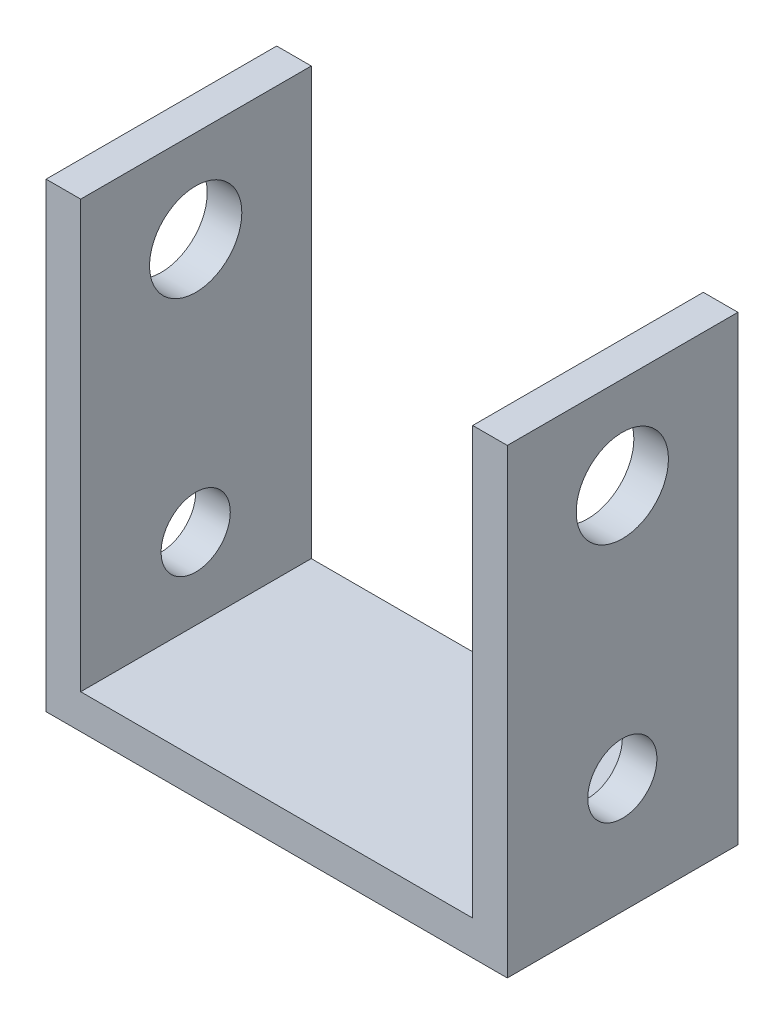
ISO-10303-21;
HEADER;
FILE_DESCRIPTION(('STEP AP214'),'2;1');
FILE_NAME('part.step','',(''),(''),'','','');
FILE_SCHEMA(('AUTOMOTIVE_DESIGN { 1 0 10303 214 1 1 1 1 }'));
ENDSEC;
DATA;
#1=APPLICATION_CONTEXT('core data for automotive mechanical design processes');
#2=APPLICATION_PROTOCOL_DEFINITION('international standard','automotive_design',2000,#1);
#3=PRODUCT_CONTEXT('',#1,'mechanical');
#4=PRODUCT('Part','Part','',(#3));
#5=PRODUCT_RELATED_PRODUCT_CATEGORY('part','',(#4));
#6=PRODUCT_DEFINITION_FORMATION('','',#4);
#7=PRODUCT_DEFINITION_CONTEXT('part definition',#1,'design');
#8=PRODUCT_DEFINITION('design','',#6,#7);
#9=PRODUCT_DEFINITION_SHAPE('','',#8);
#10=(LENGTH_UNIT() NAMED_UNIT(*) SI_UNIT(.MILLI.,.METRE.));
#11=(NAMED_UNIT(*) PLANE_ANGLE_UNIT() SI_UNIT($,.RADIAN.));
#12=(NAMED_UNIT(*) SI_UNIT($,.STERADIAN.) SOLID_ANGLE_UNIT());
#13=UNCERTAINTY_MEASURE_WITH_UNIT(LENGTH_MEASURE(1.E-05),#10,'distance_accuracy_value','');
#14=(GEOMETRIC_REPRESENTATION_CONTEXT(3) GLOBAL_UNCERTAINTY_ASSIGNED_CONTEXT((#13)) GLOBAL_UNIT_ASSIGNED_CONTEXT((#10,
#11,#12)) REPRESENTATION_CONTEXT('',''));
#15=CARTESIAN_POINT('',(0.,0.,0.));
#16=DIRECTION('',(0.,0.,1.));
#17=DIRECTION('',(1.,0.,0.));
#18=AXIS2_PLACEMENT_3D('',#15,#16,#17);
#19=CARTESIAN_POINT('',(-25.3631074324673,18.8628421052632,10.));
#20=DIRECTION('',(0.,-1.,0.));
#21=DIRECTION('',(0.,0.,-1.));
#22=AXIS2_PLACEMENT_3D('',#19,#20,#21);
#23=PLANE('',#22);
#24=DIRECTION('',(-1.,0.,0.));
#25=VECTOR('',#24,1.);
#26=CARTESIAN_POINT('',(-25.3631074324673,18.8628421052632,0.));
#27=LINE('',#26,#25);
#28=CARTESIAN_POINT('',(-25.3631074324673,18.8628421052632,0.));
#29=VERTEX_POINT('',#28);
#30=CARTESIAN_POINT('',(-26.8631074324673,18.8628421052632,0.));
#31=VERTEX_POINT('',#30);
#32=EDGE_CURVE('E129',#29,#31,#27,.T.);
#33=ORIENTED_EDGE('',*,*,#32,.T.);
#34=DIRECTION('',(0.,0.,-1.));
#35=VECTOR('',#34,1.);
#36=CARTESIAN_POINT('',(-26.8631074324673,18.8628421052632,10.));
#37=LINE('',#36,#35);
#38=CARTESIAN_POINT('',(-26.8631074324673,18.8628421052632,10.));
#39=VERTEX_POINT('',#38);
#40=EDGE_CURVE('E11',#39,#31,#37,.T.);
#41=ORIENTED_EDGE('',*,*,#40,.F.);
#42=DIRECTION('',(-1.,0.,0.));
#43=VECTOR('',#42,1.);
#44=CARTESIAN_POINT('',(-25.3631074324673,18.8628421052632,10.));
#45=LINE('',#44,#43);
#46=CARTESIAN_POINT('',(-25.3631074324673,18.8628421052632,10.));
#47=VERTEX_POINT('',#46);
#48=EDGE_CURVE('E144',#47,#39,#45,.T.);
#49=ORIENTED_EDGE('',*,*,#48,.F.);
#50=DIRECTION('',(0.,0.,-1.));
#51=VECTOR('',#50,1.);
#52=CARTESIAN_POINT('',(-25.3631074324673,18.8628421052632,10.));
#53=LINE('',#52,#51);
#54=EDGE_CURVE('E125',#47,#29,#53,.T.);
#55=ORIENTED_EDGE('',*,*,#54,.T.);
#56=EDGE_LOOP('',(#33,#41,#49,#55));
#57=FACE_BOUND('',#56,.T.);
#58=ADVANCED_FACE('F31',(#57),#23,.F.);
#59=CARTESIAN_POINT('',(-26.8631074324673,18.8628421052632,10.));
#60=DIRECTION('',(1.,0.,0.));
#61=DIRECTION('',(0.,1.,0.));
#62=AXIS2_PLACEMENT_3D('',#59,#60,#61);
#63=PLANE('',#62);
#64=CARTESIAN_POINT('',(-26.8631074324673,3.86284210526316,5.01241151123422));
#65=DIRECTION('',(1.,0.,0.));
#66=DIRECTION('',(0.,0.,-1.));
#67=AXIS2_PLACEMENT_3D('',#64,#65,#66);
#68=CIRCLE('',#67,1.5);
#69=CARTESIAN_POINT('',(-26.8631074324673,3.86284210526316,3.51241151123422));
#70=VERTEX_POINT('',#69);
#71=EDGE_CURVE('E286',#70,#70,#68,.T.);
#72=ORIENTED_EDGE('',*,*,#71,.T.);
#73=EDGE_LOOP('',(#72));
#74=FACE_BOUND('',#73,.T.);
#75=CARTESIAN_POINT('',(-26.8631074324673,14.8628421052632,5.01241151123423));
#76=DIRECTION('',(1.,0.,0.));
#77=DIRECTION('',(0.,0.,-1.));
#78=AXIS2_PLACEMENT_3D('',#75,#76,#77);
#79=CIRCLE('',#78,2.);
#80=CARTESIAN_POINT('',(-26.8631074324673,14.8628421052632,3.01241151123422));
#81=VERTEX_POINT('',#80);
#82=EDGE_CURVE('E157',#81,#81,#79,.T.);
#83=ORIENTED_EDGE('',*,*,#82,.T.);
#84=EDGE_LOOP('',(#83));
#85=FACE_BOUND('',#84,.T.);
#86=DIRECTION('',(0.,-1.,0.));
#87=VECTOR('',#86,1.);
#88=CARTESIAN_POINT('',(-26.8631074324673,18.8628421052632,0.));
#89=LINE('',#88,#87);
#90=CARTESIAN_POINT('',(-26.8631074324673,-1.13715789473684,0.));
#91=VERTEX_POINT('',#90);
#92=EDGE_CURVE('E132',#31,#91,#89,.T.);
#93=ORIENTED_EDGE('',*,*,#92,.T.);
#94=DIRECTION('',(0.,0.,-1.));
#95=VECTOR('',#94,1.);
#96=CARTESIAN_POINT('',(-26.8631074324673,-1.13715789473684,10.));
#97=LINE('',#96,#95);
#98=CARTESIAN_POINT('',(-26.8631074324673,-1.13715789473684,10.));
#99=VERTEX_POINT('',#98);
#100=EDGE_CURVE('E40',#99,#91,#97,.T.);
#101=ORIENTED_EDGE('',*,*,#100,.F.);
#102=DIRECTION('',(0.,-1.,0.));
#103=VECTOR('',#102,1.);
#104=CARTESIAN_POINT('',(-26.8631074324673,18.8628421052632,10.));
#105=LINE('',#104,#103);
#106=EDGE_CURVE('E92',#39,#99,#105,.T.);
#107=ORIENTED_EDGE('',*,*,#106,.F.);
#108=ORIENTED_EDGE('',*,*,#40,.T.);
#109=EDGE_LOOP('',(#93,#101,#107,#108));
#110=FACE_BOUND('',#109,.T.);
#111=ADVANCED_FACE('F208',(#74,#85,#110),#63,.F.);
#112=CARTESIAN_POINT('',(-26.8631074324673,-1.13715789473684,10.));
#113=DIRECTION('',(0.,1.,0.));
#114=DIRECTION('',(0.,0.,1.));
#115=AXIS2_PLACEMENT_3D('',#112,#113,#114);
#116=PLANE('',#115);
#117=DIRECTION('',(1.,0.,0.));
#118=VECTOR('',#117,1.);
#119=CARTESIAN_POINT('',(-26.8631074324673,-1.13715789473684,0.));
#120=LINE('',#119,#118);
#121=CARTESIAN_POINT('',(-6.86310743246733,-1.13715789473684,0.));
#122=VERTEX_POINT('',#121);
#123=EDGE_CURVE('E135',#91,#122,#120,.T.);
#124=ORIENTED_EDGE('',*,*,#123,.T.);
#125=DIRECTION('',(0.,0.,-1.));
#126=VECTOR('',#125,1.);
#127=CARTESIAN_POINT('',(-6.86310743246733,-1.13715789473684,10.));
#128=LINE('',#127,#126);
#129=CARTESIAN_POINT('',(-6.86310743246733,-1.13715789473684,10.));
#130=VERTEX_POINT('',#129);
#131=EDGE_CURVE('E151',#130,#122,#128,.T.);
#132=ORIENTED_EDGE('',*,*,#131,.F.);
#133=DIRECTION('',(1.,0.,0.));
#134=VECTOR('',#133,1.);
#135=CARTESIAN_POINT('',(-26.8631074324673,-1.13715789473684,10.));
#136=LINE('',#135,#134);
#137=EDGE_CURVE('E175',#99,#130,#136,.T.);
#138=ORIENTED_EDGE('',*,*,#137,.F.);
#139=ORIENTED_EDGE('',*,*,#100,.T.);
#140=EDGE_LOOP('',(#124,#132,#138,#139));
#141=FACE_BOUND('',#140,.T.);
#142=ADVANCED_FACE('F212',(#141),#116,.F.);
#143=CARTESIAN_POINT('',(-6.86310743246733,-1.13715789473684,10.));
#144=DIRECTION('',(-1.,0.,0.));
#145=DIRECTION('',(0.,0.,1.));
#146=AXIS2_PLACEMENT_3D('',#143,#144,#145);
#147=PLANE('',#146);
#148=CARTESIAN_POINT('',(-6.86310743246733,3.86284210526316,5.01241151123422));
#149=DIRECTION('',(1.,0.,0.));
#150=DIRECTION('',(0.,0.,-1.));
#151=AXIS2_PLACEMENT_3D('',#148,#149,#150);
#152=CIRCLE('',#151,1.5);
#153=CARTESIAN_POINT('',(-6.86310743246733,3.86284210526316,3.51241151123422));
#154=VERTEX_POINT('',#153);
#155=EDGE_CURVE('E285',#154,#154,#152,.T.);
#156=ORIENTED_EDGE('',*,*,#155,.F.);
#157=EDGE_LOOP('',(#156));
#158=FACE_BOUND('',#157,.T.);
#159=CARTESIAN_POINT('',(-6.86310743246733,14.8628421052632,5.01241151123423));
#160=DIRECTION('',(1.,0.,0.));
#161=DIRECTION('',(0.,0.,-1.));
#162=AXIS2_PLACEMENT_3D('',#159,#160,#161);
#163=CIRCLE('',#162,2.);
#164=CARTESIAN_POINT('',(-6.86310743246733,14.8628421052632,3.01241151123422));
#165=VERTEX_POINT('',#164);
#166=EDGE_CURVE('E163',#165,#165,#163,.T.);
#167=ORIENTED_EDGE('',*,*,#166,.F.);
#168=EDGE_LOOP('',(#167));
#169=FACE_BOUND('',#168,.T.);
#170=DIRECTION('',(0.,1.,0.));
#171=VECTOR('',#170,1.);
#172=CARTESIAN_POINT('',(-6.86310743246733,-1.13715789473684,0.));
#173=LINE('',#172,#171);
#174=CARTESIAN_POINT('',(-6.86310743246733,18.8628421052632,0.));
#175=VERTEX_POINT('',#174);
#176=EDGE_CURVE('E137',#122,#175,#173,.T.);
#177=ORIENTED_EDGE('',*,*,#176,.T.);
#178=DIRECTION('',(0.,0.,-1.));
#179=VECTOR('',#178,1.);
#180=CARTESIAN_POINT('',(-6.86310743246733,18.8628421052632,10.));
#181=LINE('',#180,#179);
#182=CARTESIAN_POINT('',(-6.86310743246733,18.8628421052632,10.));
#183=VERTEX_POINT('',#182);
#184=EDGE_CURVE('E148',#183,#175,#181,.T.);
#185=ORIENTED_EDGE('',*,*,#184,.F.);
#186=DIRECTION('',(0.,1.,0.));
#187=VECTOR('',#186,1.);
#188=CARTESIAN_POINT('',(-6.86310743246733,-1.13715789473684,10.));
#189=LINE('',#188,#187);
#190=EDGE_CURVE('E177',#130,#183,#189,.T.);
#191=ORIENTED_EDGE('',*,*,#190,.F.);
#192=ORIENTED_EDGE('',*,*,#131,.T.);
#193=EDGE_LOOP('',(#177,#185,#191,#192));
#194=FACE_BOUND('',#193,.T.);
#195=ADVANCED_FACE('F183',(#158,#169,#194),#147,.F.);
#196=CARTESIAN_POINT('',(-6.86310743246733,18.8628421052632,10.));
#197=DIRECTION('',(0.,-1.,0.));
#198=DIRECTION('',(1.,0.,0.));
#199=AXIS2_PLACEMENT_3D('',#196,#197,#198);
#200=PLANE('',#199);
#201=DIRECTION('',(-1.,0.,0.));
#202=VECTOR('',#201,1.);
#203=CARTESIAN_POINT('',(-6.86310743246733,18.8628421052632,0.));
#204=LINE('',#203,#202);
#205=CARTESIAN_POINT('',(-8.36310743246733,18.8628421052632,0.));
#206=VERTEX_POINT('',#205);
#207=EDGE_CURVE('E139',#175,#206,#204,.T.);
#208=ORIENTED_EDGE('',*,*,#207,.T.);
#209=DIRECTION('',(0.,0.,-1.));
#210=VECTOR('',#209,1.);
#211=CARTESIAN_POINT('',(-8.36310743246733,18.8628421052632,10.));
#212=LINE('',#211,#210);
#213=CARTESIAN_POINT('',(-8.36310743246733,18.8628421052632,10.));
#214=VERTEX_POINT('',#213);
#215=EDGE_CURVE('E120',#214,#206,#212,.T.);
#216=ORIENTED_EDGE('',*,*,#215,.F.);
#217=DIRECTION('',(-1.,0.,0.));
#218=VECTOR('',#217,1.);
#219=CARTESIAN_POINT('',(-6.86310743246733,18.8628421052632,10.));
#220=LINE('',#219,#218);
#221=EDGE_CURVE('E111',#183,#214,#220,.T.);
#222=ORIENTED_EDGE('',*,*,#221,.F.);
#223=ORIENTED_EDGE('',*,*,#184,.T.);
#224=EDGE_LOOP('',(#208,#216,#222,#223));
#225=FACE_BOUND('',#224,.T.);
#226=ADVANCED_FACE('F187',(#225),#200,.F.);
#227=CARTESIAN_POINT('',(-8.36310743246733,18.8628421052632,10.));
#228=DIRECTION('',(1.,0.,0.));
#229=DIRECTION('',(0.,1.,0.));
#230=AXIS2_PLACEMENT_3D('',#227,#228,#229);
#231=PLANE('',#230);
#232=CARTESIAN_POINT('',(-8.36310743246733,3.86284210526316,5.01241151123422));
#233=DIRECTION('',(1.,0.,0.));
#234=DIRECTION('',(0.,1.,0.));
#235=AXIS2_PLACEMENT_3D('',#232,#233,#234);
#236=CIRCLE('',#235,1.5);
#237=CARTESIAN_POINT('',(-8.36310743246733,3.86284210526316,3.51241151123422));
#238=VERTEX_POINT('',#237);
#239=EDGE_CURVE('E168',#238,#238,#236,.T.);
#240=ORIENTED_EDGE('',*,*,#239,.T.);
#241=EDGE_LOOP('',(#240));
#242=FACE_BOUND('',#241,.T.);
#243=CARTESIAN_POINT('',(-8.36310743246733,14.8628421052632,5.01241151123423));
#244=DIRECTION('',(1.,0.,0.));
#245=DIRECTION('',(0.,1.,0.));
#246=AXIS2_PLACEMENT_3D('',#243,#244,#245);
#247=CIRCLE('',#246,2.);
#248=CARTESIAN_POINT('',(-8.36310743246733,14.8628421052632,3.01241151123422));
#249=VERTEX_POINT('',#248);
#250=EDGE_CURVE('E133',#249,#249,#247,.T.);
#251=ORIENTED_EDGE('',*,*,#250,.T.);
#252=EDGE_LOOP('',(#251));
#253=FACE_BOUND('',#252,.T.);
#254=DIRECTION('',(0.,-1.,0.));
#255=VECTOR('',#254,1.);
#256=CARTESIAN_POINT('',(-8.36310743246733,18.8628421052632,0.));
#257=LINE('',#256,#255);
#258=CARTESIAN_POINT('',(-8.36310743246733,0.362842105263161,0.));
#259=VERTEX_POINT('',#258);
#260=EDGE_CURVE('E119',#206,#259,#257,.T.);
#261=ORIENTED_EDGE('',*,*,#260,.T.);
#262=DIRECTION('',(0.,0.,-1.));
#263=VECTOR('',#262,1.);
#264=CARTESIAN_POINT('',(-8.36310743246733,0.362842105263161,10.));
#265=LINE('',#264,#263);
#266=CARTESIAN_POINT('',(-8.36310743246733,0.362842105263161,10.));
#267=VERTEX_POINT('',#266);
#268=EDGE_CURVE('E116',#267,#259,#265,.T.);
#269=ORIENTED_EDGE('',*,*,#268,.F.);
#270=DIRECTION('',(0.,-1.,0.));
#271=VECTOR('',#270,1.);
#272=CARTESIAN_POINT('',(-8.36310743246733,18.8628421052632,10.));
#273=LINE('',#272,#271);
#274=EDGE_CURVE('E105',#214,#267,#273,.T.);
#275=ORIENTED_EDGE('',*,*,#274,.F.);
#276=ORIENTED_EDGE('',*,*,#215,.T.);
#277=EDGE_LOOP('',(#261,#269,#275,#276));
#278=FACE_BOUND('',#277,.T.);
#279=ADVANCED_FACE('F117',(#242,#253,#278),#231,.F.);
#280=CARTESIAN_POINT('',(-8.36310743246733,0.362842105263161,10.));
#281=DIRECTION('',(0.,-1.,0.));
#282=DIRECTION('',(1.,0.,0.));
#283=AXIS2_PLACEMENT_3D('',#280,#281,#282);
#284=PLANE('',#283);
#285=DIRECTION('',(-1.,0.,0.));
#286=VECTOR('',#285,1.);
#287=CARTESIAN_POINT('',(-8.36310743246733,0.362842105263161,0.));
#288=LINE('',#287,#286);
#289=CARTESIAN_POINT('',(-25.3631074324673,0.362842105263158,0.));
#290=VERTEX_POINT('',#289);
#291=EDGE_CURVE('E78',#259,#290,#288,.T.);
#292=ORIENTED_EDGE('',*,*,#291,.T.);
#293=DIRECTION('',(0.,0.,-1.));
#294=VECTOR('',#293,1.);
#295=CARTESIAN_POINT('',(-25.3631074324673,0.362842105263158,10.));
#296=LINE('',#295,#294);
#297=CARTESIAN_POINT('',(-25.3631074324673,0.362842105263158,10.));
#298=VERTEX_POINT('',#297);
#299=EDGE_CURVE('E121',#298,#290,#296,.T.);
#300=ORIENTED_EDGE('',*,*,#299,.F.);
#301=DIRECTION('',(-1.,0.,0.));
#302=VECTOR('',#301,1.);
#303=CARTESIAN_POINT('',(-8.36310743246733,0.362842105263161,10.));
#304=LINE('',#303,#302);
#305=EDGE_CURVE('E109',#267,#298,#304,.T.);
#306=ORIENTED_EDGE('',*,*,#305,.F.);
#307=ORIENTED_EDGE('',*,*,#268,.T.);
#308=EDGE_LOOP('',(#292,#300,#306,#307));
#309=FACE_BOUND('',#308,.T.);
#310=ADVANCED_FACE('F123',(#309),#284,.F.);
#311=CARTESIAN_POINT('',(-25.3631074324673,0.362842105263158,10.));
#312=DIRECTION('',(-1.,0.,0.));
#313=DIRECTION('',(0.,-1.,0.));
#314=AXIS2_PLACEMENT_3D('',#311,#312,#313);
#315=PLANE('',#314);
#316=CARTESIAN_POINT('',(-25.3631074324673,3.86284210526316,5.01241151123422));
#317=DIRECTION('',(-1.,0.,0.));
#318=DIRECTION('',(0.,-1.,0.));
#319=AXIS2_PLACEMENT_3D('',#316,#317,#318);
#320=CIRCLE('',#319,1.5);
#321=CARTESIAN_POINT('',(-25.3631074324673,3.86284210526316,3.51241151123422));
#322=VERTEX_POINT('',#321);
#323=EDGE_CURVE('E34',#322,#322,#320,.T.);
#324=ORIENTED_EDGE('',*,*,#323,.T.);
#325=EDGE_LOOP('',(#324));
#326=FACE_BOUND('',#325,.T.);
#327=CARTESIAN_POINT('',(-25.3631074324673,14.8628421052632,5.01241151123423));
#328=DIRECTION('',(-1.,0.,0.));
#329=DIRECTION('',(0.,-1.,0.));
#330=AXIS2_PLACEMENT_3D('',#327,#328,#329);
#331=CIRCLE('',#330,2.);
#332=CARTESIAN_POINT('',(-25.3631074324673,14.8628421052632,3.01241151123422));
#333=VERTEX_POINT('',#332);
#334=EDGE_CURVE('E155',#333,#333,#331,.T.);
#335=ORIENTED_EDGE('',*,*,#334,.T.);
#336=EDGE_LOOP('',(#335));
#337=FACE_BOUND('',#336,.T.);
#338=DIRECTION('',(0.,1.,0.));
#339=VECTOR('',#338,1.);
#340=CARTESIAN_POINT('',(-25.3631074324673,0.362842105263158,0.));
#341=LINE('',#340,#339);
#342=EDGE_CURVE('E84',#290,#29,#341,.T.);
#343=ORIENTED_EDGE('',*,*,#342,.T.);
#344=ORIENTED_EDGE('',*,*,#54,.F.);
#345=DIRECTION('',(0.,1.,0.));
#346=VECTOR('',#345,1.);
#347=CARTESIAN_POINT('',(-25.3631074324673,0.362842105263158,10.));
#348=LINE('',#347,#346);
#349=EDGE_CURVE('E49',#298,#47,#348,.T.);
#350=ORIENTED_EDGE('',*,*,#349,.F.);
#351=ORIENTED_EDGE('',*,*,#299,.T.);
#352=EDGE_LOOP('',(#343,#344,#350,#351));
#353=FACE_BOUND('',#352,.T.);
#354=ADVANCED_FACE('F195',(#326,#337,#353),#315,.F.);
#355=CARTESIAN_POINT('',(-26.8631074324673,18.8628421052632,10.));
#356=DIRECTION('',(0.,0.,1.));
#357=DIRECTION('',(1.,0.,0.));
#358=AXIS2_PLACEMENT_3D('',#355,#356,#357);
#359=PLANE('',#358);
#360=ORIENTED_EDGE('',*,*,#48,.T.);
#361=ORIENTED_EDGE('',*,*,#106,.T.);
#362=ORIENTED_EDGE('',*,*,#137,.T.);
#363=ORIENTED_EDGE('',*,*,#190,.T.);
#364=ORIENTED_EDGE('',*,*,#221,.T.);
#365=ORIENTED_EDGE('',*,*,#274,.T.);
#366=ORIENTED_EDGE('',*,*,#305,.T.);
#367=ORIENTED_EDGE('',*,*,#349,.T.);
#368=EDGE_LOOP('',(#360,#361,#362,#363,#364,#365,#366,#367));
#369=FACE_BOUND('',#368,.T.);
#370=ADVANCED_FACE('F107',(#369),#359,.T.);
#371=CARTESIAN_POINT('',(-26.8631074324673,18.8628421052632,0.));
#372=DIRECTION('',(0.,0.,1.));
#373=DIRECTION('',(1.,0.,0.));
#374=AXIS2_PLACEMENT_3D('',#371,#372,#373);
#375=PLANE('',#374);
#376=ORIENTED_EDGE('',*,*,#32,.F.);
#377=ORIENTED_EDGE('',*,*,#342,.F.);
#378=ORIENTED_EDGE('',*,*,#291,.F.);
#379=ORIENTED_EDGE('',*,*,#260,.F.);
#380=ORIENTED_EDGE('',*,*,#207,.F.);
#381=ORIENTED_EDGE('',*,*,#176,.F.);
#382=ORIENTED_EDGE('',*,*,#123,.F.);
#383=ORIENTED_EDGE('',*,*,#92,.F.);
#384=EDGE_LOOP('',(#376,#377,#378,#379,#380,#381,#382,#383));
#385=FACE_BOUND('',#384,.T.);
#386=ADVANCED_FACE('F190',(#385),#375,.F.);
#387=CARTESIAN_POINT('',(-26.8631074324673,14.8628421052632,5.01241151123423));
#388=DIRECTION('',(1.,0.,0.));
#389=DIRECTION('',(0.,0.,-1.));
#390=AXIS2_PLACEMENT_3D('',#387,#388,#389);
#391=CYLINDRICAL_SURFACE('',#390,2.);
#392=CARTESIAN_POINT('',(-26.8631074324673,14.8628421052632,3.01241151123422));
#393=CARTESIAN_POINT('',(-26.8474824324673,14.8628421052632,3.01241151123422));
#394=CARTESIAN_POINT('',(-26.8318574324673,14.8628421052632,3.01241151123422));
#395=CARTESIAN_POINT('',(-26.8006074324673,14.8628421052632,3.01241151123422));
#396=CARTESIAN_POINT('',(-26.7849824324673,14.8628421052632,3.01241151123422));
#397=CARTESIAN_POINT('',(-26.7537324324673,14.8628421052632,3.01241151123422));
#398=CARTESIAN_POINT('',(-26.7381074324673,14.8628421052632,3.01241151123422));
#399=CARTESIAN_POINT('',(-26.7068574324673,14.8628421052632,3.01241151123422));
#400=CARTESIAN_POINT('',(-26.6912324324673,14.8628421052632,3.01241151123422));
#401=CARTESIAN_POINT('',(-26.6599824324673,14.8628421052632,3.01241151123422));
#402=CARTESIAN_POINT('',(-26.6443574324673,14.8628421052632,3.01241151123422));
#403=CARTESIAN_POINT('',(-26.6131074324673,14.8628421052632,3.01241151123422));
#404=CARTESIAN_POINT('',(-26.5974824324673,14.8628421052632,3.01241151123422));
#405=CARTESIAN_POINT('',(-26.5662324324673,14.8628421052632,3.01241151123422));
#406=CARTESIAN_POINT('',(-26.5506074324673,14.8628421052632,3.01241151123422));
#407=CARTESIAN_POINT('',(-26.5193574324673,14.8628421052632,3.01241151123422));
#408=CARTESIAN_POINT('',(-26.5037324324673,14.8628421052632,3.01241151123422));
#409=CARTESIAN_POINT('',(-26.4724824324673,14.8628421052632,3.01241151123422));
#410=CARTESIAN_POINT('',(-26.4568574324673,14.8628421052632,3.01241151123422));
#411=CARTESIAN_POINT('',(-26.4256074324673,14.8628421052632,3.01241151123422));
#412=CARTESIAN_POINT('',(-26.4099824324673,14.8628421052632,3.01241151123422));
#413=CARTESIAN_POINT('',(-26.3787324324673,14.8628421052632,3.01241151123422));
#414=CARTESIAN_POINT('',(-26.3631074324673,14.8628421052632,3.01241151123422));
#415=CARTESIAN_POINT('',(-26.3318574324673,14.8628421052632,3.01241151123422));
#416=CARTESIAN_POINT('',(-26.3162324324673,14.8628421052632,3.01241151123422));
#417=CARTESIAN_POINT('',(-26.2849824324673,14.8628421052632,3.01241151123422));
#418=CARTESIAN_POINT('',(-26.2693574324673,14.8628421052632,3.01241151123422));
#419=CARTESIAN_POINT('',(-26.2381074324673,14.8628421052632,3.01241151123422));
#420=CARTESIAN_POINT('',(-26.2224824324673,14.8628421052632,3.01241151123422));
#421=CARTESIAN_POINT('',(-26.1912324324673,14.8628421052632,3.01241151123422));
#422=CARTESIAN_POINT('',(-26.1756074324673,14.8628421052632,3.01241151123422));
#423=CARTESIAN_POINT('',(-26.1443574324673,14.8628421052632,3.01241151123422));
#424=CARTESIAN_POINT('',(-26.1287324324673,14.8628421052632,3.01241151123422));
#425=CARTESIAN_POINT('',(-26.0974824324673,14.8628421052632,3.01241151123422));
#426=CARTESIAN_POINT('',(-26.0818574324673,14.8628421052632,3.01241151123422));
#427=CARTESIAN_POINT('',(-26.0506074324673,14.8628421052632,3.01241151123422));
#428=CARTESIAN_POINT('',(-26.0349824324673,14.8628421052632,3.01241151123422));
#429=CARTESIAN_POINT('',(-26.0037324324673,14.8628421052632,3.01241151123422));
#430=CARTESIAN_POINT('',(-25.9881074324673,14.8628421052632,3.01241151123422));
#431=CARTESIAN_POINT('',(-25.9568574324673,14.8628421052632,3.01241151123422));
#432=CARTESIAN_POINT('',(-25.9412324324673,14.8628421052632,3.01241151123422));
#433=CARTESIAN_POINT('',(-25.9099824324673,14.8628421052632,3.01241151123422));
#434=CARTESIAN_POINT('',(-25.8943574324673,14.8628421052632,3.01241151123422));
#435=CARTESIAN_POINT('',(-25.8631074324673,14.8628421052632,3.01241151123422));
#436=CARTESIAN_POINT('',(-25.8474824324673,14.8628421052632,3.01241151123422));
#437=CARTESIAN_POINT('',(-25.8162324324673,14.8628421052632,3.01241151123422));
#438=CARTESIAN_POINT('',(-25.8006074324673,14.8628421052632,3.01241151123422));
#439=CARTESIAN_POINT('',(-25.7693574324673,14.8628421052632,3.01241151123422));
#440=CARTESIAN_POINT('',(-25.7537324324673,14.8628421052632,3.01241151123422));
#441=CARTESIAN_POINT('',(-25.7224824324673,14.8628421052632,3.01241151123422));
#442=CARTESIAN_POINT('',(-25.7068574324673,14.8628421052632,3.01241151123422));
#443=CARTESIAN_POINT('',(-25.6756074324673,14.8628421052632,3.01241151123422));
#444=CARTESIAN_POINT('',(-25.6599824324673,14.8628421052632,3.01241151123422));
#445=CARTESIAN_POINT('',(-25.6287324324673,14.8628421052632,3.01241151123422));
#446=CARTESIAN_POINT('',(-25.6131074324673,14.8628421052632,3.01241151123422));
#447=CARTESIAN_POINT('',(-25.5818574324673,14.8628421052632,3.01241151123422));
#448=CARTESIAN_POINT('',(-25.5662324324673,14.8628421052632,3.01241151123422));
#449=CARTESIAN_POINT('',(-25.5349824324673,14.8628421052632,3.01241151123422));
#450=CARTESIAN_POINT('',(-25.5193574324673,14.8628421052632,3.01241151123422));
#451=CARTESIAN_POINT('',(-25.4881074324673,14.8628421052632,3.01241151123422));
#452=CARTESIAN_POINT('',(-25.4724824324673,14.8628421052632,3.01241151123422));
#453=CARTESIAN_POINT('',(-25.4412324324673,14.8628421052632,3.01241151123422));
#454=CARTESIAN_POINT('',(-25.4256074324673,14.8628421052632,3.01241151123422));
#455=CARTESIAN_POINT('',(-25.3943574324673,14.8628421052632,3.01241151123422));
#456=CARTESIAN_POINT('',(-25.3787324324673,14.8628421052632,3.01241151123422));
#457=CARTESIAN_POINT('',(-25.3631074324673,14.8628421052632,3.01241151123422));
#458=B_SPLINE_CURVE_WITH_KNOTS('',3,(#392,#393,#394,#395,#396,#397,#398,#399,#400,#401,#402,
#403,#404,#405,#406,#407,#408,#409,#410,#411,#412,#413,#414,#415,#416,#417,#418,#419,#420,#421,
#422,#423,#424,#425,#426,#427,#428,#429,#430,#431,#432,#433,#434,#435,#436,#437,#438,#439,#440,
#441,#442,#443,#444,#445,#446,#447,#448,#449,#450,#451,#452,#453,#454,#455,#456,#457),
.UNSPECIFIED.,.F.,.F.,(4,2,2,2,2,2,2,2,2,2,2,2,2,2,2,2,2,2,2,2,2,2,2,2,2,2,2,2,2,2,2,2,4),(0.,
0.0468749999999983,0.0937499999999966,0.140624999999998,0.187499999999997,0.234374999999998,
0.281249999999997,0.328124999999999,0.374999999999997,0.421874999999999,0.468749999999997,
0.515624999999999,0.562499999999997,0.609374999999999,0.656249999999997,0.703124999999999,
0.749999999999997,0.796874999999999,0.843749999999997,0.890624999999999,0.937499999999997,
0.984374999999999,1.03125,1.078125,1.125,1.171875,1.21875,1.265625,1.3125,1.359375,1.40625,
1.453125,1.5),.UNSPECIFIED.);
#459=EDGE_CURVE('BSEAM238',#81,#333,#458,.T.);
#460=ORIENTED_EDGE('',*,*,#82,.F.);
#461=ORIENTED_EDGE('',*,*,#334,.F.);
#462=ORIENTED_EDGE('',*,*,#459,.T.);
#463=ORIENTED_EDGE('',*,*,#459,.F.);
#464=EDGE_LOOP('',(#460,#462,#461,#463));
#465=FACE_BOUND('',#464,.T.);
#466=ADVANCED_FACE('F238',(#465),#391,.F.);
#467=CARTESIAN_POINT('',(-6.86310743246733,14.8628421052632,3.01241151123422));
#468=CARTESIAN_POINT('',(-6.87873243246733,14.8628421052632,3.01241151123422));
#469=CARTESIAN_POINT('',(-6.89435743246733,14.8628421052632,3.01241151123422));
#470=CARTESIAN_POINT('',(-6.92560743246733,14.8628421052632,3.01241151123422));
#471=CARTESIAN_POINT('',(-6.94123243246733,14.8628421052632,3.01241151123422));
#472=CARTESIAN_POINT('',(-6.97248243246733,14.8628421052632,3.01241151123422));
#473=CARTESIAN_POINT('',(-6.98810743246733,14.8628421052632,3.01241151123422));
#474=CARTESIAN_POINT('',(-7.01935743246733,14.8628421052632,3.01241151123422));
#475=CARTESIAN_POINT('',(-7.03498243246733,14.8628421052632,3.01241151123422));
#476=CARTESIAN_POINT('',(-7.06623243246733,14.8628421052632,3.01241151123422));
#477=CARTESIAN_POINT('',(-7.08185743246733,14.8628421052632,3.01241151123422));
#478=CARTESIAN_POINT('',(-7.11310743246733,14.8628421052632,3.01241151123422));
#479=CARTESIAN_POINT('',(-7.12873243246733,14.8628421052632,3.01241151123422));
#480=CARTESIAN_POINT('',(-7.15998243246733,14.8628421052632,3.01241151123422));
#481=CARTESIAN_POINT('',(-7.17560743246733,14.8628421052632,3.01241151123422));
#482=CARTESIAN_POINT('',(-7.20685743246733,14.8628421052632,3.01241151123422));
#483=CARTESIAN_POINT('',(-7.22248243246733,14.8628421052632,3.01241151123422));
#484=CARTESIAN_POINT('',(-7.25373243246733,14.8628421052632,3.01241151123422));
#485=CARTESIAN_POINT('',(-7.26935743246733,14.8628421052632,3.01241151123422));
#486=CARTESIAN_POINT('',(-7.30060743246733,14.8628421052632,3.01241151123422));
#487=CARTESIAN_POINT('',(-7.31623243246733,14.8628421052632,3.01241151123422));
#488=CARTESIAN_POINT('',(-7.34748243246733,14.8628421052632,3.01241151123422));
#489=CARTESIAN_POINT('',(-7.36310743246733,14.8628421052632,3.01241151123422));
#490=CARTESIAN_POINT('',(-7.39435743246733,14.8628421052632,3.01241151123422));
#491=CARTESIAN_POINT('',(-7.40998243246733,14.8628421052632,3.01241151123422));
#492=CARTESIAN_POINT('',(-7.44123243246733,14.8628421052632,3.01241151123422));
#493=CARTESIAN_POINT('',(-7.45685743246733,14.8628421052632,3.01241151123422));
#494=CARTESIAN_POINT('',(-7.48810743246733,14.8628421052632,3.01241151123422));
#495=CARTESIAN_POINT('',(-7.50373243246733,14.8628421052632,3.01241151123422));
#496=CARTESIAN_POINT('',(-7.53498243246733,14.8628421052632,3.01241151123422));
#497=CARTESIAN_POINT('',(-7.55060743246733,14.8628421052632,3.01241151123422));
#498=CARTESIAN_POINT('',(-7.58185743246733,14.8628421052632,3.01241151123422));
#499=CARTESIAN_POINT('',(-7.59748243246733,14.8628421052632,3.01241151123422));
#500=CARTESIAN_POINT('',(-7.62873243246733,14.8628421052632,3.01241151123422));
#501=CARTESIAN_POINT('',(-7.64435743246733,14.8628421052632,3.01241151123422));
#502=CARTESIAN_POINT('',(-7.67560743246733,14.8628421052632,3.01241151123422));
#503=CARTESIAN_POINT('',(-7.69123243246733,14.8628421052632,3.01241151123422));
#504=CARTESIAN_POINT('',(-7.72248243246733,14.8628421052632,3.01241151123422));
#505=CARTESIAN_POINT('',(-7.73810743246733,14.8628421052632,3.01241151123422));
#506=CARTESIAN_POINT('',(-7.76935743246733,14.8628421052632,3.01241151123422));
#507=CARTESIAN_POINT('',(-7.78498243246733,14.8628421052632,3.01241151123422));
#508=CARTESIAN_POINT('',(-7.81623243246733,14.8628421052632,3.01241151123422));
#509=CARTESIAN_POINT('',(-7.83185743246733,14.8628421052632,3.01241151123422));
#510=CARTESIAN_POINT('',(-7.86310743246733,14.8628421052632,3.01241151123422));
#511=CARTESIAN_POINT('',(-7.87873243246733,14.8628421052632,3.01241151123422));
#512=CARTESIAN_POINT('',(-7.90998243246733,14.8628421052632,3.01241151123422));
#513=CARTESIAN_POINT('',(-7.92560743246733,14.8628421052632,3.01241151123422));
#514=CARTESIAN_POINT('',(-7.95685743246733,14.8628421052632,3.01241151123422));
#515=CARTESIAN_POINT('',(-7.97248243246733,14.8628421052632,3.01241151123422));
#516=CARTESIAN_POINT('',(-8.00373243246733,14.8628421052632,3.01241151123422));
#517=CARTESIAN_POINT('',(-8.01935743246733,14.8628421052632,3.01241151123422));
#518=CARTESIAN_POINT('',(-8.05060743246733,14.8628421052632,3.01241151123422));
#519=CARTESIAN_POINT('',(-8.06623243246733,14.8628421052632,3.01241151123422));
#520=CARTESIAN_POINT('',(-8.09748243246733,14.8628421052632,3.01241151123422));
#521=CARTESIAN_POINT('',(-8.11310743246733,14.8628421052632,3.01241151123422));
#522=CARTESIAN_POINT('',(-8.14435743246733,14.8628421052632,3.01241151123422));
#523=CARTESIAN_POINT('',(-8.15998243246733,14.8628421052632,3.01241151123422));
#524=CARTESIAN_POINT('',(-8.19123243246733,14.8628421052632,3.01241151123422));
#525=CARTESIAN_POINT('',(-8.20685743246733,14.8628421052632,3.01241151123422));
#526=CARTESIAN_POINT('',(-8.23810743246733,14.8628421052632,3.01241151123422));
#527=CARTESIAN_POINT('',(-8.25373243246733,14.8628421052632,3.01241151123422));
#528=CARTESIAN_POINT('',(-8.28498243246733,14.8628421052632,3.01241151123422));
#529=CARTESIAN_POINT('',(-8.30060743246733,14.8628421052632,3.01241151123422));
#530=CARTESIAN_POINT('',(-8.33185743246733,14.8628421052632,3.01241151123422));
#531=CARTESIAN_POINT('',(-8.34748243246733,14.8628421052632,3.01241151123422));
#532=CARTESIAN_POINT('',(-8.36310743246733,14.8628421052632,3.01241151123422));
#533=B_SPLINE_CURVE_WITH_KNOTS('',3,(#467,#468,#469,#470,#471,#472,#473,#474,#475,#476,#477,
#478,#479,#480,#481,#482,#483,#484,#485,#486,#487,#488,#489,#490,#491,#492,#493,#494,#495,#496,
#497,#498,#499,#500,#501,#502,#503,#504,#505,#506,#507,#508,#509,#510,#511,#512,#513,#514,#515,
#516,#517,#518,#519,#520,#521,#522,#523,#524,#525,#526,#527,#528,#529,#530,#531,#532),
.UNSPECIFIED.,.F.,.F.,(4,2,2,2,2,2,2,2,2,2,2,2,2,2,2,2,2,2,2,2,2,2,2,2,2,2,2,2,2,2,2,2,4),(0.,
0.0468750000000018,0.0937500000000001,0.140624999999998,0.1875,0.234375000000002,0.28125,
0.328124999999999,0.375,0.421875000000002,0.46875,0.515624999999999,0.5625,0.609375000000002,
0.656250000000001,0.703124999999999,0.750000000000001,0.796875000000002,0.843750000000001,
0.890624999999999,0.937500000000001,0.984375000000003,1.03125,1.078125,1.125,1.171875,1.21875,
1.265625,1.3125,1.359375,1.40625,1.453125,1.5),.UNSPECIFIED.);
#534=EDGE_CURVE('BSEAM235',#165,#249,#533,.T.);
#535=ORIENTED_EDGE('',*,*,#166,.T.);
#536=ORIENTED_EDGE('',*,*,#250,.F.);
#537=ORIENTED_EDGE('',*,*,#534,.T.);
#538=ORIENTED_EDGE('',*,*,#534,.F.);
#539=EDGE_LOOP('',(#535,#537,#536,#538));
#540=FACE_BOUND('',#539,.T.);
#541=ADVANCED_FACE('F235',(#540),#391,.F.);
#542=CARTESIAN_POINT('',(-26.8631074324673,3.86284210526316,5.01241151123422));
#543=DIRECTION('',(1.,0.,0.));
#544=DIRECTION('',(0.,0.,-1.));
#545=AXIS2_PLACEMENT_3D('',#542,#543,#544);
#546=CYLINDRICAL_SURFACE('',#545,1.5);
#547=CARTESIAN_POINT('',(-26.8631074324673,3.86284210526316,3.51241151123422));
#548=CARTESIAN_POINT('',(-26.8474824324673,3.86284210526316,3.51241151123422));
#549=CARTESIAN_POINT('',(-26.8318574324673,3.86284210526316,3.51241151123422));
#550=CARTESIAN_POINT('',(-26.8006074324673,3.86284210526316,3.51241151123422));
#551=CARTESIAN_POINT('',(-26.7849824324673,3.86284210526316,3.51241151123422));
#552=CARTESIAN_POINT('',(-26.7537324324673,3.86284210526316,3.51241151123422));
#553=CARTESIAN_POINT('',(-26.7381074324673,3.86284210526316,3.51241151123422));
#554=CARTESIAN_POINT('',(-26.7068574324673,3.86284210526316,3.51241151123422));
#555=CARTESIAN_POINT('',(-26.6912324324673,3.86284210526316,3.51241151123422));
#556=CARTESIAN_POINT('',(-26.6599824324673,3.86284210526316,3.51241151123422));
#557=CARTESIAN_POINT('',(-26.6443574324673,3.86284210526316,3.51241151123422));
#558=CARTESIAN_POINT('',(-26.6131074324673,3.86284210526316,3.51241151123422));
#559=CARTESIAN_POINT('',(-26.5974824324673,3.86284210526316,3.51241151123422));
#560=CARTESIAN_POINT('',(-26.5662324324673,3.86284210526316,3.51241151123422));
#561=CARTESIAN_POINT('',(-26.5506074324673,3.86284210526316,3.51241151123422));
#562=CARTESIAN_POINT('',(-26.5193574324673,3.86284210526316,3.51241151123422));
#563=CARTESIAN_POINT('',(-26.5037324324673,3.86284210526316,3.51241151123422));
#564=CARTESIAN_POINT('',(-26.4724824324673,3.86284210526316,3.51241151123422));
#565=CARTESIAN_POINT('',(-26.4568574324673,3.86284210526316,3.51241151123422));
#566=CARTESIAN_POINT('',(-26.4256074324673,3.86284210526316,3.51241151123422));
#567=CARTESIAN_POINT('',(-26.4099824324673,3.86284210526316,3.51241151123422));
#568=CARTESIAN_POINT('',(-26.3787324324673,3.86284210526316,3.51241151123422));
#569=CARTESIAN_POINT('',(-26.3631074324673,3.86284210526316,3.51241151123422));
#570=CARTESIAN_POINT('',(-26.3318574324673,3.86284210526316,3.51241151123422));
#571=CARTESIAN_POINT('',(-26.3162324324673,3.86284210526316,3.51241151123422));
#572=CARTESIAN_POINT('',(-26.2849824324673,3.86284210526316,3.51241151123422));
#573=CARTESIAN_POINT('',(-26.2693574324673,3.86284210526316,3.51241151123422));
#574=CARTESIAN_POINT('',(-26.2381074324673,3.86284210526316,3.51241151123422));
#575=CARTESIAN_POINT('',(-26.2224824324673,3.86284210526316,3.51241151123422));
#576=CARTESIAN_POINT('',(-26.1912324324673,3.86284210526316,3.51241151123422));
#577=CARTESIAN_POINT('',(-26.1756074324673,3.86284210526316,3.51241151123422));
#578=CARTESIAN_POINT('',(-26.1443574324673,3.86284210526316,3.51241151123422));
#579=CARTESIAN_POINT('',(-26.1287324324673,3.86284210526316,3.51241151123422));
#580=CARTESIAN_POINT('',(-26.0974824324673,3.86284210526316,3.51241151123422));
#581=CARTESIAN_POINT('',(-26.0818574324673,3.86284210526316,3.51241151123422));
#582=CARTESIAN_POINT('',(-26.0506074324673,3.86284210526316,3.51241151123422));
#583=CARTESIAN_POINT('',(-26.0349824324673,3.86284210526316,3.51241151123422));
#584=CARTESIAN_POINT('',(-26.0037324324673,3.86284210526316,3.51241151123422));
#585=CARTESIAN_POINT('',(-25.9881074324673,3.86284210526316,3.51241151123422));
#586=CARTESIAN_POINT('',(-25.9568574324673,3.86284210526316,3.51241151123422));
#587=CARTESIAN_POINT('',(-25.9412324324673,3.86284210526316,3.51241151123422));
#588=CARTESIAN_POINT('',(-25.9099824324673,3.86284210526316,3.51241151123422));
#589=CARTESIAN_POINT('',(-25.8943574324673,3.86284210526316,3.51241151123422));
#590=CARTESIAN_POINT('',(-25.8631074324673,3.86284210526316,3.51241151123422));
#591=CARTESIAN_POINT('',(-25.8474824324673,3.86284210526316,3.51241151123422));
#592=CARTESIAN_POINT('',(-25.8162324324673,3.86284210526316,3.51241151123422));
#593=CARTESIAN_POINT('',(-25.8006074324673,3.86284210526316,3.51241151123422));
#594=CARTESIAN_POINT('',(-25.7693574324673,3.86284210526316,3.51241151123422));
#595=CARTESIAN_POINT('',(-25.7537324324673,3.86284210526316,3.51241151123422));
#596=CARTESIAN_POINT('',(-25.7224824324673,3.86284210526316,3.51241151123422));
#597=CARTESIAN_POINT('',(-25.7068574324673,3.86284210526316,3.51241151123422));
#598=CARTESIAN_POINT('',(-25.6756074324673,3.86284210526316,3.51241151123422));
#599=CARTESIAN_POINT('',(-25.6599824324673,3.86284210526316,3.51241151123422));
#600=CARTESIAN_POINT('',(-25.6287324324673,3.86284210526316,3.51241151123422));
#601=CARTESIAN_POINT('',(-25.6131074324673,3.86284210526316,3.51241151123422));
#602=CARTESIAN_POINT('',(-25.5818574324673,3.86284210526316,3.51241151123422));
#603=CARTESIAN_POINT('',(-25.5662324324673,3.86284210526316,3.51241151123422));
#604=CARTESIAN_POINT('',(-25.5349824324673,3.86284210526316,3.51241151123422));
#605=CARTESIAN_POINT('',(-25.5193574324673,3.86284210526316,3.51241151123422));
#606=CARTESIAN_POINT('',(-25.4881074324673,3.86284210526316,3.51241151123422));
#607=CARTESIAN_POINT('',(-25.4724824324673,3.86284210526316,3.51241151123422));
#608=CARTESIAN_POINT('',(-25.4412324324673,3.86284210526316,3.51241151123422));
#609=CARTESIAN_POINT('',(-25.4256074324673,3.86284210526316,3.51241151123422));
#610=CARTESIAN_POINT('',(-25.3943574324673,3.86284210526316,3.51241151123422));
#611=CARTESIAN_POINT('',(-25.3787324324673,3.86284210526316,3.51241151123422));
#612=CARTESIAN_POINT('',(-25.3631074324673,3.86284210526316,3.51241151123422));
#613=B_SPLINE_CURVE_WITH_KNOTS('',3,(#547,#548,#549,#550,#551,#552,#553,#554,#555,#556,#557,
#558,#559,#560,#561,#562,#563,#564,#565,#566,#567,#568,#569,#570,#571,#572,#573,#574,#575,#576,
#577,#578,#579,#580,#581,#582,#583,#584,#585,#586,#587,#588,#589,#590,#591,#592,#593,#594,#595,
#596,#597,#598,#599,#600,#601,#602,#603,#604,#605,#606,#607,#608,#609,#610,#611,#612),
.UNSPECIFIED.,.F.,.F.,(4,2,2,2,2,2,2,2,2,2,2,2,2,2,2,2,2,2,2,2,2,2,2,2,2,2,2,2,2,2,2,2,4),(0.,
0.0468750000000018,0.0937500000000036,0.140625000000002,0.187500000000004,0.234375000000002,
0.281250000000004,0.328125000000002,0.375000000000004,0.421875000000002,0.468750000000004,
0.515625000000002,0.562500000000004,0.609375000000002,0.656250000000004,0.703125000000002,
0.750000000000004,0.796875000000006,0.843750000000004,0.890625000000006,0.937500000000004,
0.984375000000006,1.03125,1.07812500000001,1.125,1.17187500000001,1.21875,1.26562500000001,
1.3125,1.35937500000001,1.40625000000001,1.45312500000001,1.50000000000001),.UNSPECIFIED.);
#614=EDGE_CURVE('BSEAM237',#70,#322,#613,.T.);
#615=ORIENTED_EDGE('',*,*,#71,.F.);
#616=ORIENTED_EDGE('',*,*,#323,.F.);
#617=ORIENTED_EDGE('',*,*,#614,.T.);
#618=ORIENTED_EDGE('',*,*,#614,.F.);
#619=EDGE_LOOP('',(#615,#617,#616,#618));
#620=FACE_BOUND('',#619,.T.);
#621=ADVANCED_FACE('F237',(#620),#546,.F.);
#622=CARTESIAN_POINT('',(-6.86310743246733,3.86284210526316,3.51241151123422));
#623=CARTESIAN_POINT('',(-6.87873243246733,3.86284210526316,3.51241151123422));
#624=CARTESIAN_POINT('',(-6.89435743246733,3.86284210526316,3.51241151123422));
#625=CARTESIAN_POINT('',(-6.92560743246733,3.86284210526316,3.51241151123422));
#626=CARTESIAN_POINT('',(-6.94123243246733,3.86284210526316,3.51241151123422));
#627=CARTESIAN_POINT('',(-6.97248243246733,3.86284210526316,3.51241151123422));
#628=CARTESIAN_POINT('',(-6.98810743246733,3.86284210526316,3.51241151123422));
#629=CARTESIAN_POINT('',(-7.01935743246733,3.86284210526316,3.51241151123422));
#630=CARTESIAN_POINT('',(-7.03498243246733,3.86284210526316,3.51241151123422));
#631=CARTESIAN_POINT('',(-7.06623243246733,3.86284210526316,3.51241151123422));
#632=CARTESIAN_POINT('',(-7.08185743246733,3.86284210526316,3.51241151123422));
#633=CARTESIAN_POINT('',(-7.11310743246733,3.86284210526316,3.51241151123422));
#634=CARTESIAN_POINT('',(-7.12873243246733,3.86284210526316,3.51241151123422));
#635=CARTESIAN_POINT('',(-7.15998243246733,3.86284210526316,3.51241151123422));
#636=CARTESIAN_POINT('',(-7.17560743246733,3.86284210526316,3.51241151123422));
#637=CARTESIAN_POINT('',(-7.20685743246733,3.86284210526316,3.51241151123422));
#638=CARTESIAN_POINT('',(-7.22248243246733,3.86284210526316,3.51241151123422));
#639=CARTESIAN_POINT('',(-7.25373243246733,3.86284210526316,3.51241151123422));
#640=CARTESIAN_POINT('',(-7.26935743246733,3.86284210526316,3.51241151123422));
#641=CARTESIAN_POINT('',(-7.30060743246733,3.86284210526316,3.51241151123422));
#642=CARTESIAN_POINT('',(-7.31623243246733,3.86284210526316,3.51241151123422));
#643=CARTESIAN_POINT('',(-7.34748243246733,3.86284210526316,3.51241151123422));
#644=CARTESIAN_POINT('',(-7.36310743246733,3.86284210526316,3.51241151123422));
#645=CARTESIAN_POINT('',(-7.39435743246733,3.86284210526316,3.51241151123422));
#646=CARTESIAN_POINT('',(-7.40998243246733,3.86284210526316,3.51241151123422));
#647=CARTESIAN_POINT('',(-7.44123243246733,3.86284210526316,3.51241151123422));
#648=CARTESIAN_POINT('',(-7.45685743246733,3.86284210526316,3.51241151123422));
#649=CARTESIAN_POINT('',(-7.48810743246733,3.86284210526316,3.51241151123422));
#650=CARTESIAN_POINT('',(-7.50373243246733,3.86284210526316,3.51241151123422));
#651=CARTESIAN_POINT('',(-7.53498243246733,3.86284210526316,3.51241151123422));
#652=CARTESIAN_POINT('',(-7.55060743246733,3.86284210526316,3.51241151123422));
#653=CARTESIAN_POINT('',(-7.58185743246733,3.86284210526316,3.51241151123422));
#654=CARTESIAN_POINT('',(-7.59748243246733,3.86284210526316,3.51241151123422));
#655=CARTESIAN_POINT('',(-7.62873243246733,3.86284210526316,3.51241151123422));
#656=CARTESIAN_POINT('',(-7.64435743246733,3.86284210526316,3.51241151123422));
#657=CARTESIAN_POINT('',(-7.67560743246733,3.86284210526316,3.51241151123422));
#658=CARTESIAN_POINT('',(-7.69123243246733,3.86284210526316,3.51241151123422));
#659=CARTESIAN_POINT('',(-7.72248243246733,3.86284210526316,3.51241151123422));
#660=CARTESIAN_POINT('',(-7.73810743246733,3.86284210526316,3.51241151123422));
#661=CARTESIAN_POINT('',(-7.76935743246733,3.86284210526316,3.51241151123422));
#662=CARTESIAN_POINT('',(-7.78498243246733,3.86284210526316,3.51241151123422));
#663=CARTESIAN_POINT('',(-7.81623243246733,3.86284210526316,3.51241151123422));
#664=CARTESIAN_POINT('',(-7.83185743246733,3.86284210526316,3.51241151123422));
#665=CARTESIAN_POINT('',(-7.86310743246733,3.86284210526316,3.51241151123422));
#666=CARTESIAN_POINT('',(-7.87873243246733,3.86284210526316,3.51241151123422));
#667=CARTESIAN_POINT('',(-7.90998243246733,3.86284210526316,3.51241151123422));
#668=CARTESIAN_POINT('',(-7.92560743246733,3.86284210526316,3.51241151123422));
#669=CARTESIAN_POINT('',(-7.95685743246733,3.86284210526316,3.51241151123422));
#670=CARTESIAN_POINT('',(-7.97248243246733,3.86284210526316,3.51241151123422));
#671=CARTESIAN_POINT('',(-8.00373243246733,3.86284210526316,3.51241151123422));
#672=CARTESIAN_POINT('',(-8.01935743246733,3.86284210526316,3.51241151123422));
#673=CARTESIAN_POINT('',(-8.05060743246733,3.86284210526316,3.51241151123422));
#674=CARTESIAN_POINT('',(-8.06623243246733,3.86284210526316,3.51241151123422));
#675=CARTESIAN_POINT('',(-8.09748243246733,3.86284210526316,3.51241151123422));
#676=CARTESIAN_POINT('',(-8.11310743246733,3.86284210526316,3.51241151123422));
#677=CARTESIAN_POINT('',(-8.14435743246733,3.86284210526316,3.51241151123422));
#678=CARTESIAN_POINT('',(-8.15998243246733,3.86284210526316,3.51241151123422));
#679=CARTESIAN_POINT('',(-8.19123243246733,3.86284210526316,3.51241151123422));
#680=CARTESIAN_POINT('',(-8.20685743246733,3.86284210526316,3.51241151123422));
#681=CARTESIAN_POINT('',(-8.23810743246733,3.86284210526316,3.51241151123422));
#682=CARTESIAN_POINT('',(-8.25373243246733,3.86284210526316,3.51241151123422));
#683=CARTESIAN_POINT('',(-8.28498243246733,3.86284210526316,3.51241151123422));
#684=CARTESIAN_POINT('',(-8.30060743246733,3.86284210526316,3.51241151123422));
#685=CARTESIAN_POINT('',(-8.33185743246733,3.86284210526316,3.51241151123422));
#686=CARTESIAN_POINT('',(-8.34748243246733,3.86284210526316,3.51241151123422));
#687=CARTESIAN_POINT('',(-8.36310743246733,3.86284210526316,3.51241151123422));
#688=B_SPLINE_CURVE_WITH_KNOTS('',3,(#622,#623,#624,#625,#626,#627,#628,#629,#630,#631,#632,
#633,#634,#635,#636,#637,#638,#639,#640,#641,#642,#643,#644,#645,#646,#647,#648,#649,#650,#651,
#652,#653,#654,#655,#656,#657,#658,#659,#660,#661,#662,#663,#664,#665,#666,#667,#668,#669,#670,
#671,#672,#673,#674,#675,#676,#677,#678,#679,#680,#681,#682,#683,#684,#685,#686,#687),
.UNSPECIFIED.,.F.,.F.,(4,2,2,2,2,2,2,2,2,2,2,2,2,2,2,2,2,2,2,2,2,2,2,2,2,2,2,2,2,2,2,2,4),(0.,
0.0468750000000018,0.0937500000000001,0.140624999999998,0.1875,0.234375000000002,0.28125,
0.328124999999999,0.375,0.421875000000002,0.46875,0.515624999999999,0.5625,0.609375000000002,
0.656250000000001,0.703124999999999,0.750000000000001,0.796875000000002,0.843750000000001,
0.890624999999999,0.937500000000001,0.984375000000003,1.03125,1.078125,1.125,1.171875,1.21875,
1.265625,1.3125,1.359375,1.40625,1.453125,1.5),.UNSPECIFIED.);
#689=EDGE_CURVE('BSEAM245',#154,#238,#688,.T.);
#690=ORIENTED_EDGE('',*,*,#155,.T.);
#691=ORIENTED_EDGE('',*,*,#239,.F.);
#692=ORIENTED_EDGE('',*,*,#689,.T.);
#693=ORIENTED_EDGE('',*,*,#689,.F.);
#694=EDGE_LOOP('',(#690,#692,#691,#693));
#695=FACE_BOUND('',#694,.T.);
#696=ADVANCED_FACE('F245',(#695),#546,.F.);
#697=CLOSED_SHELL('',(#58,#111,#142,#195,#226,#279,#310,#354,#370,#386,#466,#541,#621,#696));
#698=MANIFOLD_SOLID_BREP('B2',#697);
#699=ADVANCED_BREP_SHAPE_REPRESENTATION('',(#18,#698),#14);
#700=SHAPE_DEFINITION_REPRESENTATION(#9,#699);
ENDSEC;
END-ISO-10303-21;
